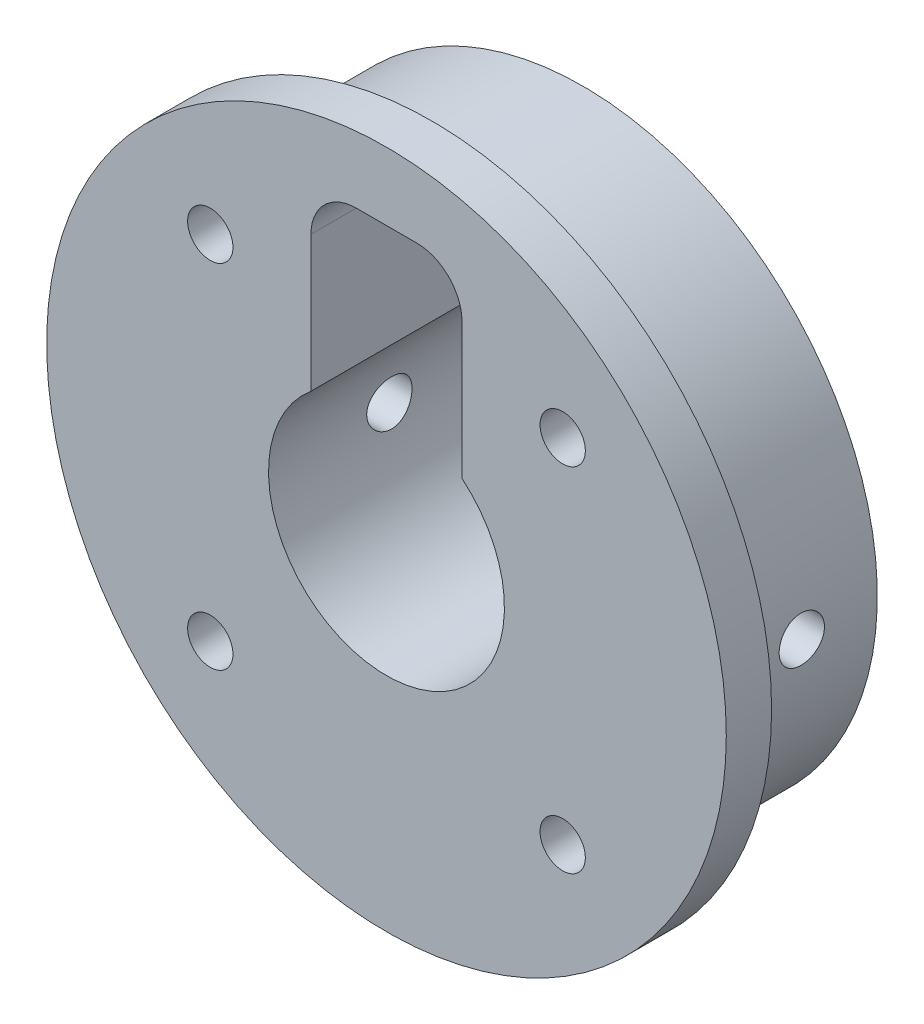
ISO-10303-21;
HEADER;
FILE_DESCRIPTION(('STEP AP214'),'2;1');
FILE_NAME('part.step','',(''),(''),'','','');
FILE_SCHEMA(('AUTOMOTIVE_DESIGN { 1 0 10303 214 1 1 1 1 }'));
ENDSEC;
DATA;
#1=APPLICATION_CONTEXT('core data for automotive mechanical design processes');
#2=APPLICATION_PROTOCOL_DEFINITION('international standard','automotive_design',2000,#1);
#3=PRODUCT_CONTEXT('',#1,'mechanical');
#4=PRODUCT('Part','Part','',(#3));
#5=PRODUCT_RELATED_PRODUCT_CATEGORY('part','',(#4));
#6=PRODUCT_DEFINITION_FORMATION('','',#4);
#7=PRODUCT_DEFINITION_CONTEXT('part definition',#1,'design');
#8=PRODUCT_DEFINITION('design','',#6,#7);
#9=PRODUCT_DEFINITION_SHAPE('','',#8);
#10=(LENGTH_UNIT() NAMED_UNIT(*) SI_UNIT(.MILLI.,.METRE.));
#11=(NAMED_UNIT(*) PLANE_ANGLE_UNIT() SI_UNIT($,.RADIAN.));
#12=(NAMED_UNIT(*) SI_UNIT($,.STERADIAN.) SOLID_ANGLE_UNIT());
#13=UNCERTAINTY_MEASURE_WITH_UNIT(LENGTH_MEASURE(1.E-05),#10,'distance_accuracy_value','');
#14=(GEOMETRIC_REPRESENTATION_CONTEXT(3) GLOBAL_UNCERTAINTY_ASSIGNED_CONTEXT((#13)) GLOBAL_UNIT_ASSIGNED_CONTEXT((#10,
#11,#12)) REPRESENTATION_CONTEXT('',''));
#15=CARTESIAN_POINT('',(0.,0.,0.));
#16=DIRECTION('',(0.,0.,1.));
#17=DIRECTION('',(1.,0.,0.));
#18=AXIS2_PLACEMENT_3D('',#15,#16,#17);
#19=CARTESIAN_POINT('',(750.,29.3136232268283,3.));
#20=DIRECTION('',(0.,0.,-1.));
#21=DIRECTION('',(-1.,0.,0.));
#22=AXIS2_PLACEMENT_3D('',#19,#20,#21);
#23=CYLINDRICAL_SURFACE('',#22,22.5);
#24=CARTESIAN_POINT('',(750.,29.3136232268283,3.));
#25=DIRECTION('',(0.,0.,1.));
#26=DIRECTION('',(1.,0.,0.));
#27=AXIS2_PLACEMENT_3D('',#24,#25,#26);
#28=CIRCLE('',#27,22.5);
#29=CARTESIAN_POINT('',(772.5,29.3136232268283,3.));
#30=VERTEX_POINT('',#29);
#31=EDGE_CURVE('E46',#30,#30,#28,.T.);
#32=ORIENTED_EDGE('',*,*,#31,.F.);
#33=EDGE_LOOP('',(#32));
#34=FACE_BOUND('',#33,.T.);
#35=CARTESIAN_POINT('',(750.,29.3136232268283,0.));
#36=DIRECTION('',(0.,0.,1.));
#37=DIRECTION('',(1.,0.,0.));
#38=AXIS2_PLACEMENT_3D('',#35,#36,#37);
#39=CIRCLE('',#38,22.5);
#40=CARTESIAN_POINT('',(772.5,29.3136232268283,0.));
#41=VERTEX_POINT('',#40);
#42=EDGE_CURVE('E154',#41,#41,#39,.T.);
#43=ORIENTED_EDGE('',*,*,#42,.T.);
#44=EDGE_LOOP('',(#43));
#45=FACE_BOUND('',#44,.T.);
#46=ADVANCED_FACE('F33',(#34,#45),#23,.T.);
#47=CARTESIAN_POINT('',(750.,29.3136232268283,3.));
#48=DIRECTION('',(0.,0.,1.));
#49=DIRECTION('',(1.,0.,0.));
#50=AXIS2_PLACEMENT_3D('',#47,#48,#49);
#51=PLANE('',#50);
#52=DIRECTION('',(0.,1.,0.));
#53=VECTOR('',#52,1.);
#54=CARTESIAN_POINT('',(755.,44.3136232268282,3.));
#55=LINE('',#54,#53);
#56=CARTESIAN_POINT('',(755.,35.3136232268283,3.));
#57=VERTEX_POINT('',#56);
#58=CARTESIAN_POINT('',(755.,44.3136232268282,3.));
#59=VERTEX_POINT('',#58);
#60=EDGE_CURVE('E109',#57,#59,#55,.T.);
#61=ORIENTED_EDGE('',*,*,#60,.F.);
#62=CARTESIAN_POINT('',(750.,29.3136232268283,3.));
#63=DIRECTION('',(0.,0.,1.));
#64=DIRECTION('',(1.,0.,0.));
#65=AXIS2_PLACEMENT_3D('',#62,#63,#64);
#66=CIRCLE('',#65,7.81024967590666);
#67=CARTESIAN_POINT('',(745.,35.3136232268283,3.));
#68=VERTEX_POINT('',#67);
#69=EDGE_CURVE('E121',#68,#57,#66,.T.);
#70=ORIENTED_EDGE('',*,*,#69,.F.);
#71=DIRECTION('',(0.,-1.,0.));
#72=VECTOR('',#71,1.);
#73=CARTESIAN_POINT('',(745.,44.3136232268282,3.));
#74=LINE('',#73,#72);
#75=CARTESIAN_POINT('',(745.,44.3136232268282,3.));
#76=VERTEX_POINT('',#75);
#77=EDGE_CURVE('E54',#76,#68,#74,.T.);
#78=ORIENTED_EDGE('',*,*,#77,.F.);
#79=CARTESIAN_POINT('',(748.,44.3136232268283,3.));
#80=DIRECTION('',(0.,0.,1.));
#81=DIRECTION('',(1.,0.,0.));
#82=AXIS2_PLACEMENT_3D('',#79,#80,#81);
#83=CIRCLE('',#82,3.);
#84=CARTESIAN_POINT('',(748.,47.3136232268283,3.));
#85=VERTEX_POINT('',#84);
#86=EDGE_CURVE('E117',#85,#76,#83,.T.);
#87=ORIENTED_EDGE('',*,*,#86,.F.);
#88=DIRECTION('',(-1.,0.,0.));
#89=VECTOR('',#88,1.);
#90=CARTESIAN_POINT('',(748.,47.3136232268283,3.));
#91=LINE('',#90,#89);
#92=CARTESIAN_POINT('',(752.,47.3136232268283,3.));
#93=VERTEX_POINT('',#92);
#94=EDGE_CURVE('E357',#93,#85,#91,.T.);
#95=ORIENTED_EDGE('',*,*,#94,.F.);
#96=CARTESIAN_POINT('',(752.,44.3136232268283,3.));
#97=DIRECTION('',(0.,0.,1.));
#98=DIRECTION('',(-1.,0.,0.));
#99=AXIS2_PLACEMENT_3D('',#96,#97,#98);
#100=CIRCLE('',#99,3.);
#101=EDGE_CURVE('E356',#59,#93,#100,.T.);
#102=ORIENTED_EDGE('',*,*,#101,.F.);
#103=EDGE_LOOP('',(#61,#70,#78,#87,#95,#102));
#104=FACE_BOUND('',#103,.T.);
#105=CARTESIAN_POINT('',(738.332738110422,17.6463613372503,3.));
#106=DIRECTION('',(0.,0.,1.));
#107=DIRECTION('',(1.,0.,0.));
#108=AXIS2_PLACEMENT_3D('',#105,#106,#107);
#109=CIRCLE('',#108,1.49999999999997);
#110=CARTESIAN_POINT('',(739.832738110422,17.6463613372503,3.));
#111=VERTEX_POINT('',#110);
#112=EDGE_CURVE('E140',#111,#111,#109,.T.);
#113=ORIENTED_EDGE('',*,*,#112,.F.);
#114=EDGE_LOOP('',(#113));
#115=FACE_BOUND('',#114,.T.);
#116=CARTESIAN_POINT('',(738.332738110422,40.9808851164064,3.));
#117=DIRECTION('',(0.,0.,1.));
#118=DIRECTION('',(1.,0.,0.));
#119=AXIS2_PLACEMENT_3D('',#116,#117,#118);
#120=CIRCLE('',#119,1.49999999999997);
#121=CARTESIAN_POINT('',(739.832738110422,40.9808851164064,3.));
#122=VERTEX_POINT('',#121);
#123=EDGE_CURVE('E367',#122,#122,#120,.T.);
#124=ORIENTED_EDGE('',*,*,#123,.F.);
#125=EDGE_LOOP('',(#124));
#126=FACE_BOUND('',#125,.T.);
#127=CARTESIAN_POINT('',(761.667261889578,40.9808851164062,3.));
#128=DIRECTION('',(0.,0.,1.));
#129=DIRECTION('',(1.,0.,0.));
#130=AXIS2_PLACEMENT_3D('',#127,#128,#129);
#131=CIRCLE('',#130,1.49999999999997);
#132=CARTESIAN_POINT('',(763.167261889578,40.9808851164062,3.));
#133=VERTEX_POINT('',#132);
#134=EDGE_CURVE('E368',#133,#133,#131,.T.);
#135=ORIENTED_EDGE('',*,*,#134,.F.);
#136=EDGE_LOOP('',(#135));
#137=FACE_BOUND('',#136,.T.);
#138=CARTESIAN_POINT('',(761.667261889578,17.6463613372502,3.));
#139=DIRECTION('',(0.,0.,1.));
#140=DIRECTION('',(1.,0.,0.));
#141=AXIS2_PLACEMENT_3D('',#138,#139,#140);
#142=CIRCLE('',#141,1.49999999999997);
#143=CARTESIAN_POINT('',(763.167261889578,17.6463613372502,3.));
#144=VERTEX_POINT('',#143);
#145=EDGE_CURVE('E139',#144,#144,#142,.T.);
#146=ORIENTED_EDGE('',*,*,#145,.F.);
#147=EDGE_LOOP('',(#146));
#148=FACE_BOUND('',#147,.T.);
#149=ORIENTED_EDGE('',*,*,#31,.T.);
#150=EDGE_LOOP('',(#149));
#151=FACE_BOUND('',#150,.T.);
#152=ADVANCED_FACE('F199',(#104,#115,#126,#137,#148,#151),#51,.T.);
#153=CARTESIAN_POINT('',(750.,29.3136232268283,0.));
#154=DIRECTION('',(0.,0.,1.));
#155=DIRECTION('',(1.,0.,0.));
#156=AXIS2_PLACEMENT_3D('',#153,#154,#155);
#157=PLANE('',#156);
#158=CARTESIAN_POINT('',(750.,29.3136232268283,0.));
#159=DIRECTION('',(0.,0.,-1.));
#160=DIRECTION('',(-1.,0.,0.));
#161=AXIS2_PLACEMENT_3D('',#158,#159,#160);
#162=CIRCLE('',#161,19.4999999999999);
#163=CARTESIAN_POINT('',(730.5,29.3136232268283,0.));
#164=VERTEX_POINT('',#163);
#165=EDGE_CURVE('E11',#164,#164,#162,.T.);
#166=ORIENTED_EDGE('',*,*,#165,.F.);
#167=EDGE_LOOP('',(#166));
#168=FACE_BOUND('',#167,.T.);
#169=ORIENTED_EDGE('',*,*,#42,.F.);
#170=EDGE_LOOP('',(#169));
#171=FACE_BOUND('',#170,.T.);
#172=ADVANCED_FACE('F196',(#168,#171),#157,.F.);
#173=CARTESIAN_POINT('',(750.,29.3136232268283,-10.));
#174=DIRECTION('',(0.,0.,1.));
#175=DIRECTION('',(1.,0.,0.));
#176=AXIS2_PLACEMENT_3D('',#173,#174,#175);
#177=CYLINDRICAL_SURFACE('',#176,19.4999999999999);
#178=CARTESIAN_POINT('',(769.5,29.3136232268283,-6.50000000000001));
#179=CARTESIAN_POINT('',(769.499999240329,29.2295009906735,-6.49999631612383));
#180=CARTESIAN_POINT('',(769.499449840663,29.1453209343391,-6.49289965396325));
#181=CARTESIAN_POINT('',(769.4973109979,28.9792883284067,-6.46469326607501));
#182=CARTESIAN_POINT('',(769.495720365639,28.8974385518272,-6.44356751768256));
#183=CARTESIAN_POINT('',(769.491678872511,28.738495314461,-6.38791607922069));
#184=CARTESIAN_POINT('',(769.489228487342,28.6613992511427,-6.35339779806699));
#185=CARTESIAN_POINT('',(769.483742556748,28.5141144470609,-6.27195398912453));
#186=CARTESIAN_POINT('',(769.480707139512,28.4439241982119,-6.2250311785145));
#187=CARTESIAN_POINT('',(769.474384506987,28.3122704498914,-6.11999870744527));
#188=CARTESIAN_POINT('',(769.471096813979,28.2508241690554,-6.06186749104647));
#189=CARTESIAN_POINT('',(769.464644203124,28.1385502020399,-5.93611362551084));
#190=CARTESIAN_POINT('',(769.461479290585,28.0877229744524,-5.86849056667229));
#191=CARTESIAN_POINT('',(769.45562529375,27.9980729496452,-5.7255700394826));
#192=CARTESIAN_POINT('',(769.452936802632,27.9592650730584,-5.65026318545963));
#193=CARTESIAN_POINT('',(769.448345262151,27.8948507084839,-5.49417828328676));
#194=CARTESIAN_POINT('',(769.446442200757,27.8692440182933,-5.41340031895939));
#195=CARTESIAN_POINT('',(769.443640832669,27.832008306894,-5.24883709209566));
#196=CARTESIAN_POINT('',(769.44274052867,27.8203514966662,-5.16505815193368));
#197=CARTESIAN_POINT('',(769.442040232918,27.8112606108248,-4.99672832487932));
#198=CARTESIAN_POINT('',(769.442240223289,27.8138263041254,-4.91217745055154));
#199=CARTESIAN_POINT('',(769.443716110968,27.8330846012521,-4.74489391091556));
#200=CARTESIAN_POINT('',(769.444989711576,27.8497470491416,-4.66215775085566));
#201=CARTESIAN_POINT('',(769.448465702716,27.8966790444788,-4.50066003886764));
#202=CARTESIAN_POINT('',(769.450668101139,27.9269487075386,-4.42189852071592));
#203=CARTESIAN_POINT('',(769.45575616458,28.0002698123731,-4.27048947061114));
#204=CARTESIAN_POINT('',(769.458642554889,28.0433348344692,-4.19784854040406));
#205=CARTESIAN_POINT('',(769.464772674995,28.1410143949215,-4.06081486040461));
#206=CARTESIAN_POINT('',(769.468016410941,28.1956291320535,-3.99642225260013));
#207=CARTESIAN_POINT('',(769.474505928725,28.3150271854894,-3.87753770949489));
#208=CARTESIAN_POINT('',(769.477751693938,28.3798365812263,-3.82307196192597));
#209=CARTESIAN_POINT('',(769.483871475001,28.5176931196159,-3.72578953626857));
#210=CARTESIAN_POINT('',(769.486745490647,28.590740266764,-3.68297286453731));
#211=CARTESIAN_POINT('',(769.491798371356,28.7430154073111,-3.61020582566758));
#212=CARTESIAN_POINT('',(769.493977176817,28.8222439299303,-3.58025656160756));
#213=CARTESIAN_POINT('',(769.497393421365,28.9846252469381,-3.53409253716758));
#214=CARTESIAN_POINT('',(769.498630877098,29.0677779719082,-3.51787753392713));
#215=CARTESIAN_POINT('',(769.500022853301,29.2354202289245,-3.49967501879704));
#216=CARTESIAN_POINT('',(769.500180127908,29.3199058102681,-3.4976513230533));
#217=CARTESIAN_POINT('',(769.499401366525,29.4880150994303,-3.50779416234267));
#218=CARTESIAN_POINT('',(769.498465339204,29.5716388140779,-3.51996058485493));
#219=CARTESIAN_POINT('',(769.49560704767,29.735547848141,-3.55810832036623));
#220=CARTESIAN_POINT('',(769.493685976772,29.8158370801327,-3.58407291917263));
#221=CARTESIAN_POINT('',(769.489073510374,29.97091908414,-3.64906292966387));
#222=CARTESIAN_POINT('',(769.486382104448,30.0457117817555,-3.68808851810011));
#223=CARTESIAN_POINT('',(769.48052404355,30.1878426448235,-3.77818404496661));
#224=CARTESIAN_POINT('',(769.477356444753,30.2551655337424,-3.82927802070011));
#225=CARTESIAN_POINT('',(769.470905257215,30.3802916657135,-3.94202514023412));
#226=CARTESIAN_POINT('',(769.467621666756,30.4380947677437,-4.00367844042824));
#227=CARTESIAN_POINT('',(769.461300477786,30.5426641059793,-4.13595081174335));
#228=CARTESIAN_POINT('',(769.458263413415,30.5894067763267,-4.20658854214855));
#229=CARTESIAN_POINT('',(769.452786433225,30.670366949817,-4.35473145186864));
#230=CARTESIAN_POINT('',(769.450346512205,30.7045845620479,-4.43223657136415));
#231=CARTESIAN_POINT('',(769.446342888643,30.7594829369239,-4.59182984208193));
#232=CARTESIAN_POINT('',(769.444778243733,30.7801782624209,-4.67391295923841));
#233=CARTESIAN_POINT('',(769.442699053004,30.8074920642696,-4.84040145112596));
#234=CARTESIAN_POINT('',(769.442184490331,30.8141107665626,-4.92480678856146));
#235=CARTESIAN_POINT('',(769.442263919749,30.8130809941976,-5.09330954611887));
#236=CARTESIAN_POINT('',(769.442855034413,30.8054695522476,-5.17740719640398));
#237=CARTESIAN_POINT('',(769.445073105625,30.7762726257923,-5.34312619791526));
#238=CARTESIAN_POINT('',(769.446700063867,30.7546871184431,-5.42474754509312));
#239=CARTESIAN_POINT('',(769.450805756996,30.6981638575086,-5.58320041168871));
#240=CARTESIAN_POINT('',(769.453284459351,30.6632266138792,-5.66003211391176));
#241=CARTESIAN_POINT('',(769.458814377236,30.5809959847591,-5.80674525726494));
#242=CARTESIAN_POINT('',(769.461865581814,30.5337028356212,-5.87662683130703));
#243=CARTESIAN_POINT('',(769.468206099535,30.427964073564,-6.00764522480086));
#244=CARTESIAN_POINT('',(769.471495982727,30.3694911764461,-6.06875999660285));
#245=CARTESIAN_POINT('',(769.477938012782,30.2430994351566,-6.18033061393549));
#246=CARTESIAN_POINT('',(769.481090126003,30.1751783004836,-6.23078386733981));
#247=CARTESIAN_POINT('',(769.486906301575,30.0317055870545,-6.31965640961626));
#248=CARTESIAN_POINT('',(769.489569551509,29.9561416244903,-6.35805574051926));
#249=CARTESIAN_POINT('',(769.494098032498,29.7996710699569,-6.42157341954096));
#250=CARTESIAN_POINT('',(769.495964186248,29.7187707811351,-6.44670713153661));
#251=CARTESIAN_POINT('',(769.498205757804,29.5834264721995,-6.4765344902111));
#252=CARTESIAN_POINT('',(769.498875560298,29.5298544495082,-6.4853224684822));
#253=CARTESIAN_POINT('',(769.499772925798,29.4220707039385,-6.49705640448193));
#254=CARTESIAN_POINT('',(769.500000489779,29.3678589824706,-6.50000237508913));
#255=CARTESIAN_POINT('',(769.5,29.3136232268283,-6.50000000000001));
#256=B_SPLINE_CURVE_WITH_KNOTS('',3,(#178,#179,#180,#181,#182,#183,#184,#185,#186,#187,#188,
#189,#190,#191,#192,#193,#194,#195,#196,#197,#198,#199,#200,#201,#202,#203,#204,#205,#206,#207,
#208,#209,#210,#211,#212,#213,#214,#215,#216,#217,#218,#219,#220,#221,#222,#223,#224,#225,#226,
#227,#228,#229,#230,#231,#232,#233,#234,#235,#236,#237,#238,#239,#240,#241,#242,#243,#244,#245,
#246,#247,#248,#249,#250,#251,#252,#253,#254,#255),.UNSPECIFIED.,.T.,.F.,(4,2,2,2,2,2,2,2,2,2,2,
2,2,2,2,2,2,2,2,2,2,2,2,2,2,2,2,2,2,2,2,2,2,2,2,2,2,2,4),(0.,0.252168697972929,
0.504625895091495,0.756943628431351,1.00920613798227,1.26195872563513,1.51472222634619,
1.76779825752813,2.02087041222531,2.27343758794004,2.52600065998191,2.77802480841939,
3.03005109819102,3.28234583677959,3.53464491782508,3.78760023996436,4.04055570014811,
4.29353284100557,4.54650550841981,4.79883293118749,5.05115835313294,5.3031788192332,
5.55520269600725,5.80773284029632,6.0602667251199,6.31333392041088,6.56639891154052,
6.81919091267429,7.07197885625816,7.32410985684674,7.57624126960227,7.82836305341542,
8.08048001480753,8.33322030876309,8.58602198074126,8.83924004130861,9.0921641845181,
9.25474414742467,9.41732375192724),.UNSPECIFIED.);
#257=CARTESIAN_POINT('',(769.5,29.3136232268283,-6.50000000000001));
#258=VERTEX_POINT('',#257);
#259=EDGE_CURVE('E186',#258,#258,#256,.T.);
#260=ORIENTED_EDGE('',*,*,#259,.T.);
#261=EDGE_LOOP('',(#260));
#262=FACE_BOUND('',#261,.T.);
#263=CARTESIAN_POINT('',(730.5,29.3136232268283,-6.50000000000001));
#264=CARTESIAN_POINT('',(730.500000759671,29.3977454629831,-6.49999631612383));
#265=CARTESIAN_POINT('',(730.500550159337,29.4819255193175,-6.49289965396326));
#266=CARTESIAN_POINT('',(730.5026890021,29.6479581252499,-6.46469326607502));
#267=CARTESIAN_POINT('',(730.504279634361,29.7298079018294,-6.44356751768257));
#268=CARTESIAN_POINT('',(730.508321127489,29.8887511391956,-6.3879160792207));
#269=CARTESIAN_POINT('',(730.510771512658,29.9658472025139,-6.35339779806701));
#270=CARTESIAN_POINT('',(730.516257443252,30.1131320065957,-6.27195398912455));
#271=CARTESIAN_POINT('',(730.519292860488,30.1833222554447,-6.22503117851453));
#272=CARTESIAN_POINT('',(730.525615493013,30.3149760037652,-6.1199987074453));
#273=CARTESIAN_POINT('',(730.528903186021,30.3764222846012,-6.06186749104651));
#274=CARTESIAN_POINT('',(730.535355796876,30.4886962516167,-5.93611362551088));
#275=CARTESIAN_POINT('',(730.538520709415,30.5395234792042,-5.86849056667233));
#276=CARTESIAN_POINT('',(730.54437470625,30.6291735040114,-5.72557003948264));
#277=CARTESIAN_POINT('',(730.547063197368,30.6679813805982,-5.65026318545967));
#278=CARTESIAN_POINT('',(730.55165473785,30.7323957451727,-5.49417828328681));
#279=CARTESIAN_POINT('',(730.553557799244,30.7580024353633,-5.41340031895943));
#280=CARTESIAN_POINT('',(730.556359167331,30.7952381467626,-5.2488370920957));
#281=CARTESIAN_POINT('',(730.557259471331,30.8068949569904,-5.16505815193372));
#282=CARTESIAN_POINT('',(730.557959767082,30.8159858428319,-4.99672832487937));
#283=CARTESIAN_POINT('',(730.557759776711,30.8134201495313,-4.91217745055159));
#284=CARTESIAN_POINT('',(730.556283889033,30.7941618524045,-4.7448939109156));
#285=CARTESIAN_POINT('',(730.555010288424,30.777499404515,-4.6621577508557));
#286=CARTESIAN_POINT('',(730.551534297285,30.7305674091778,-4.50066003886768));
#287=CARTESIAN_POINT('',(730.549331898862,30.700297746118,-4.42189852071597));
#288=CARTESIAN_POINT('',(730.54424383542,30.6269766412835,-4.27048947061119));
#289=CARTESIAN_POINT('',(730.541357445111,30.5839116191874,-4.1978485404041));
#290=CARTESIAN_POINT('',(730.535227325006,30.4862320587351,-4.06081486040464));
#291=CARTESIAN_POINT('',(730.531983589059,30.4316173216032,-3.99642225260016));
#292=CARTESIAN_POINT('',(730.525494071276,30.3122192681673,-3.87753770949491));
#293=CARTESIAN_POINT('',(730.522248306062,30.2474098724303,-3.823071961926));
#294=CARTESIAN_POINT('',(730.516128525,30.1095533340408,-3.72578953626859));
#295=CARTESIAN_POINT('',(730.513254509354,30.0365061868926,-3.68297286453733));
#296=CARTESIAN_POINT('',(730.508201628645,29.8842310463456,-3.6102058256676));
#297=CARTESIAN_POINT('',(730.506022823183,29.8050025237263,-3.58025656160758));
#298=CARTESIAN_POINT('',(730.502606578635,29.6426212067186,-3.53409253716759));
#299=CARTESIAN_POINT('',(730.501369122902,29.5594684817484,-3.51787753392713));
#300=CARTESIAN_POINT('',(730.499977146699,29.3918262247322,-3.49967501879704));
#301=CARTESIAN_POINT('',(730.499819872092,29.3073406433886,-3.4976513230533));
#302=CARTESIAN_POINT('',(730.500598633475,29.1392313542264,-3.50779416234266));
#303=CARTESIAN_POINT('',(730.501534660796,29.0556076395788,-3.51996058485492));
#304=CARTESIAN_POINT('',(730.50439295233,28.8916986055157,-3.55810832036622));
#305=CARTESIAN_POINT('',(730.506314023228,28.811409373524,-3.58407291917262));
#306=CARTESIAN_POINT('',(730.510926489626,28.6563273695167,-3.64906292966385));
#307=CARTESIAN_POINT('',(730.513617895552,28.5815346719012,-3.68808851810009));
#308=CARTESIAN_POINT('',(730.519475956451,28.4394038088332,-3.77818404496659));
#309=CARTESIAN_POINT('',(730.522643555247,28.3720809199142,-3.82927802070008));
#310=CARTESIAN_POINT('',(730.529094742785,28.2469547879431,-3.94202514023409));
#311=CARTESIAN_POINT('',(730.532378333244,28.1891516859129,-4.00367844042821));
#312=CARTESIAN_POINT('',(730.538699522214,28.0845823476773,-4.13595081174331));
#313=CARTESIAN_POINT('',(730.541736586585,28.0378396773299,-4.20658854214852));
#314=CARTESIAN_POINT('',(730.547213566775,27.9568795038396,-4.3547314518686));
#315=CARTESIAN_POINT('',(730.549653487795,27.9226618916087,-4.43223657136411));
#316=CARTESIAN_POINT('',(730.553657111357,27.8677635167327,-4.59182984208189));
#317=CARTESIAN_POINT('',(730.555221756268,27.8470681912357,-4.67391295923837));
#318=CARTESIAN_POINT('',(730.557300946996,27.8197543893871,-4.84040145112592));
#319=CARTESIAN_POINT('',(730.557815509669,27.813135687094,-4.92480678856142));
#320=CARTESIAN_POINT('',(730.557736080251,27.814165459459,-5.09330954611883));
#321=CARTESIAN_POINT('',(730.557144965587,27.821776901409,-5.17740719640393));
#322=CARTESIAN_POINT('',(730.554926894375,27.8509738278643,-5.34312619791522));
#323=CARTESIAN_POINT('',(730.553299936133,27.8725593352135,-5.42474754509308));
#324=CARTESIAN_POINT('',(730.549194243005,27.929082596148,-5.58320041168867));
#325=CARTESIAN_POINT('',(730.546715540649,27.9640198397774,-5.66003211391172));
#326=CARTESIAN_POINT('',(730.541185622764,28.0462504688975,-5.8067452572649));
#327=CARTESIAN_POINT('',(730.538134418187,28.0935436180354,-5.87662683130699));
#328=CARTESIAN_POINT('',(730.531793900465,28.1992823800926,-6.00764522480083));
#329=CARTESIAN_POINT('',(730.528504017274,28.2577552772105,-6.06875999660282));
#330=CARTESIAN_POINT('',(730.522061987218,28.3841470185,-6.18033061393547));
#331=CARTESIAN_POINT('',(730.518909873998,28.452068153173,-6.23078386733978));
#332=CARTESIAN_POINT('',(730.513093698425,28.5955408666021,-6.31965640961624));
#333=CARTESIAN_POINT('',(730.510430448491,28.6711048291663,-6.35805574051924));
#334=CARTESIAN_POINT('',(730.505901967502,28.8275753836997,-6.42157341954095));
#335=CARTESIAN_POINT('',(730.504035813752,28.9084756725215,-6.4467071315366));
#336=CARTESIAN_POINT('',(730.501794242196,29.043819981457,-6.4765344902111));
#337=CARTESIAN_POINT('',(730.501124439702,29.0973920041484,-6.48532246848219));
#338=CARTESIAN_POINT('',(730.500227074203,29.205175749718,-6.49705640448193));
#339=CARTESIAN_POINT('',(730.499999510221,29.2593874711859,-6.50000237508913));
#340=CARTESIAN_POINT('',(730.5,29.3136232268283,-6.50000000000001));
#341=B_SPLINE_CURVE_WITH_KNOTS('',3,(#263,#264,#265,#266,#267,#268,#269,#270,#271,#272,#273,
#274,#275,#276,#277,#278,#279,#280,#281,#282,#283,#284,#285,#286,#287,#288,#289,#290,#291,#292,
#293,#294,#295,#296,#297,#298,#299,#300,#301,#302,#303,#304,#305,#306,#307,#308,#309,#310,#311,
#312,#313,#314,#315,#316,#317,#318,#319,#320,#321,#322,#323,#324,#325,#326,#327,#328,#329,#330,
#331,#332,#333,#334,#335,#336,#337,#338,#339,#340),.UNSPECIFIED.,.T.,.F.,(4,2,2,2,2,2,2,2,2,2,2,
2,2,2,2,2,2,2,2,2,2,2,2,2,2,2,2,2,2,2,2,2,2,2,2,2,2,2,4),(0.,0.252168697972932,
0.504625895091496,0.756943628431356,1.00920613798227,1.26195872563512,1.51472222634618,
1.76779825752813,2.02087041222532,2.27343758794005,2.52600065998191,2.77802480841939,
3.03005109819102,3.28234583677959,3.53464491782508,3.78760023996436,4.04055570014811,
4.29353284100557,4.54650550841982,4.7988329311875,5.05115835313294,5.30317881923321,
5.55520269600725,5.80773284029632,6.0602667251199,6.31333392041088,6.56639891154052,
6.81919091267429,7.07197885625816,7.32410985684674,7.57624126960227,7.82836305341542,
8.08048001480753,8.33322030876309,8.58602198074126,8.83924004130862,9.0921641845181,
9.25474414742467,9.41732375192724),.UNSPECIFIED.);
#342=CARTESIAN_POINT('',(730.5,29.3136232268283,-6.50000000000001));
#343=VERTEX_POINT('',#342);
#344=EDGE_CURVE('E180',#343,#343,#341,.T.);
#345=ORIENTED_EDGE('',*,*,#344,.T.);
#346=EDGE_LOOP('',(#345));
#347=FACE_BOUND('',#346,.T.);
#348=CARTESIAN_POINT('',(750.,29.3136232268283,-10.));
#349=DIRECTION('',(0.,0.,-1.));
#350=DIRECTION('',(-1.,0.,0.));
#351=AXIS2_PLACEMENT_3D('',#348,#349,#350);
#352=CIRCLE('',#351,19.4999999999999);
#353=CARTESIAN_POINT('',(730.5,29.3136232268283,-10.));
#354=VERTEX_POINT('',#353);
#355=EDGE_CURVE('E152',#354,#354,#352,.T.);
#356=ORIENTED_EDGE('',*,*,#355,.F.);
#357=EDGE_LOOP('',(#356));
#358=FACE_BOUND('',#357,.T.);
#359=ORIENTED_EDGE('',*,*,#165,.T.);
#360=EDGE_LOOP('',(#359));
#361=FACE_BOUND('',#360,.T.);
#362=ADVANCED_FACE('F191',(#262,#347,#358,#361),#177,.T.);
#363=CARTESIAN_POINT('',(750.,29.3136232268283,-10.));
#364=DIRECTION('',(0.,0.,-1.));
#365=DIRECTION('',(-1.,0.,0.));
#366=AXIS2_PLACEMENT_3D('',#363,#364,#365);
#367=PLANE('',#366);
#368=DIRECTION('',(0.,1.,0.));
#369=VECTOR('',#368,1.);
#370=CARTESIAN_POINT('',(755.,44.3136232268282,-10.));
#371=LINE('',#370,#369);
#372=CARTESIAN_POINT('',(755.,35.3136232268283,-10.));
#373=VERTEX_POINT('',#372);
#374=CARTESIAN_POINT('',(755.,44.3136232268282,-10.));
#375=VERTEX_POINT('',#374);
#376=EDGE_CURVE('E106',#373,#375,#371,.T.);
#377=ORIENTED_EDGE('',*,*,#376,.T.);
#378=CARTESIAN_POINT('',(752.,44.3136232268283,-10.));
#379=DIRECTION('',(0.,0.,-1.));
#380=DIRECTION('',(-1.,0.,0.));
#381=AXIS2_PLACEMENT_3D('',#378,#379,#380);
#382=CIRCLE('',#381,3.);
#383=CARTESIAN_POINT('',(752.,47.3136232268283,-10.));
#384=VERTEX_POINT('',#383);
#385=EDGE_CURVE('E93',#375,#384,#382,.F.);
#386=ORIENTED_EDGE('',*,*,#385,.T.);
#387=DIRECTION('',(-1.,0.,0.));
#388=VECTOR('',#387,1.);
#389=CARTESIAN_POINT('',(748.,47.3136232268283,-10.));
#390=LINE('',#389,#388);
#391=CARTESIAN_POINT('',(748.,47.3136232268283,-10.));
#392=VERTEX_POINT('',#391);
#393=EDGE_CURVE('E132',#384,#392,#390,.T.);
#394=ORIENTED_EDGE('',*,*,#393,.T.);
#395=CARTESIAN_POINT('',(748.,44.3136232268283,-10.));
#396=DIRECTION('',(0.,0.,-1.));
#397=DIRECTION('',(-1.,0.,0.));
#398=AXIS2_PLACEMENT_3D('',#395,#396,#397);
#399=CIRCLE('',#398,3.);
#400=CARTESIAN_POINT('',(745.,44.3136232268283,-10.));
#401=VERTEX_POINT('',#400);
#402=EDGE_CURVE('E128',#392,#401,#399,.F.);
#403=ORIENTED_EDGE('',*,*,#402,.T.);
#404=DIRECTION('',(0.,-1.,0.));
#405=VECTOR('',#404,1.);
#406=CARTESIAN_POINT('',(745.,44.3136232268282,-10.));
#407=LINE('',#406,#405);
#408=CARTESIAN_POINT('',(745.,35.3136232268283,-10.));
#409=VERTEX_POINT('',#408);
#410=EDGE_CURVE('E125',#401,#409,#407,.T.);
#411=ORIENTED_EDGE('',*,*,#410,.T.);
#412=CARTESIAN_POINT('',(750.,29.3136232268283,-10.));
#413=DIRECTION('',(0.,0.,-1.));
#414=DIRECTION('',(-1.,0.,0.));
#415=AXIS2_PLACEMENT_3D('',#412,#413,#414);
#416=CIRCLE('',#415,7.81024967590666);
#417=EDGE_CURVE('E115',#409,#373,#416,.F.);
#418=ORIENTED_EDGE('',*,*,#417,.T.);
#419=EDGE_LOOP('',(#377,#386,#394,#403,#411,#418));
#420=FACE_BOUND('',#419,.T.);
#421=CARTESIAN_POINT('',(738.332738110422,17.6463613372503,-10.));
#422=DIRECTION('',(0.,0.,-1.));
#423=DIRECTION('',(-1.,0.,0.));
#424=AXIS2_PLACEMENT_3D('',#421,#422,#423);
#425=CIRCLE('',#424,1.49999999999997);
#426=CARTESIAN_POINT('',(736.832738110422,17.6463613372503,-10.));
#427=VERTEX_POINT('',#426);
#428=EDGE_CURVE('E143',#427,#427,#425,.F.);
#429=ORIENTED_EDGE('',*,*,#428,.T.);
#430=EDGE_LOOP('',(#429));
#431=FACE_BOUND('',#430,.T.);
#432=CARTESIAN_POINT('',(738.332738110422,40.9808851164064,-10.));
#433=DIRECTION('',(0.,0.,-1.));
#434=DIRECTION('',(-1.,0.,0.));
#435=AXIS2_PLACEMENT_3D('',#432,#433,#434);
#436=CIRCLE('',#435,1.49999999999997);
#437=CARTESIAN_POINT('',(736.832738110422,40.9808851164064,-10.));
#438=VERTEX_POINT('',#437);
#439=EDGE_CURVE('E144',#438,#438,#436,.F.);
#440=ORIENTED_EDGE('',*,*,#439,.T.);
#441=EDGE_LOOP('',(#440));
#442=FACE_BOUND('',#441,.T.);
#443=CARTESIAN_POINT('',(761.667261889578,40.9808851164062,-10.));
#444=DIRECTION('',(0.,0.,-1.));
#445=DIRECTION('',(-1.,0.,0.));
#446=AXIS2_PLACEMENT_3D('',#443,#444,#445);
#447=CIRCLE('',#446,1.49999999999997);
#448=CARTESIAN_POINT('',(760.167261889578,40.9808851164062,-10.));
#449=VERTEX_POINT('',#448);
#450=EDGE_CURVE('E364',#449,#449,#447,.F.);
#451=ORIENTED_EDGE('',*,*,#450,.T.);
#452=EDGE_LOOP('',(#451));
#453=FACE_BOUND('',#452,.T.);
#454=CARTESIAN_POINT('',(761.667261889578,17.6463613372502,-10.));
#455=DIRECTION('',(0.,0.,-1.));
#456=DIRECTION('',(-1.,0.,0.));
#457=AXIS2_PLACEMENT_3D('',#454,#455,#456);
#458=CIRCLE('',#457,1.49999999999997);
#459=CARTESIAN_POINT('',(760.167261889578,17.6463613372502,-10.));
#460=VERTEX_POINT('',#459);
#461=EDGE_CURVE('E149',#460,#460,#458,.F.);
#462=ORIENTED_EDGE('',*,*,#461,.T.);
#463=EDGE_LOOP('',(#462));
#464=FACE_BOUND('',#463,.T.);
#465=ORIENTED_EDGE('',*,*,#355,.T.);
#466=EDGE_LOOP('',(#465));
#467=FACE_BOUND('',#466,.T.);
#468=ADVANCED_FACE('F112',(#420,#431,#442,#453,#464,#467),#367,.T.);
#469=CARTESIAN_POINT('',(761.667261889578,17.6463613372502,-40.1690070823129));
#470=DIRECTION('',(0.,0.,1.));
#471=DIRECTION('',(1.,0.,0.));
#472=AXIS2_PLACEMENT_3D('',#469,#470,#471);
#473=CYLINDRICAL_SURFACE('',#472,1.49999999999997);
#474=ORIENTED_EDGE('',*,*,#145,.T.);
#475=EDGE_LOOP('',(#474));
#476=FACE_BOUND('',#475,.T.);
#477=ORIENTED_EDGE('',*,*,#461,.F.);
#478=EDGE_LOOP('',(#477));
#479=FACE_BOUND('',#478,.T.);
#480=ADVANCED_FACE('F232',(#476,#479),#473,.F.);
#481=CARTESIAN_POINT('',(761.667261889578,40.9808851164062,-40.1690070823129));
#482=DIRECTION('',(0.,0.,1.));
#483=DIRECTION('',(1.,0.,0.));
#484=AXIS2_PLACEMENT_3D('',#481,#482,#483);
#485=CYLINDRICAL_SURFACE('',#484,1.49999999999997);
#486=ORIENTED_EDGE('',*,*,#134,.T.);
#487=EDGE_LOOP('',(#486));
#488=FACE_BOUND('',#487,.T.);
#489=ORIENTED_EDGE('',*,*,#450,.F.);
#490=EDGE_LOOP('',(#489));
#491=FACE_BOUND('',#490,.T.);
#492=ADVANCED_FACE('F241',(#488,#491),#485,.F.);
#493=CARTESIAN_POINT('',(738.332738110422,40.9808851164064,-40.1690070823129));
#494=DIRECTION('',(0.,0.,1.));
#495=DIRECTION('',(1.,0.,0.));
#496=AXIS2_PLACEMENT_3D('',#493,#494,#495);
#497=CYLINDRICAL_SURFACE('',#496,1.49999999999997);
#498=ORIENTED_EDGE('',*,*,#123,.T.);
#499=EDGE_LOOP('',(#498));
#500=FACE_BOUND('',#499,.T.);
#501=ORIENTED_EDGE('',*,*,#439,.F.);
#502=EDGE_LOOP('',(#501));
#503=FACE_BOUND('',#502,.T.);
#504=ADVANCED_FACE('F174',(#500,#503),#497,.F.);
#505=CARTESIAN_POINT('',(738.332738110422,17.6463613372503,-40.1690070823129));
#506=DIRECTION('',(0.,0.,1.));
#507=DIRECTION('',(1.,0.,0.));
#508=AXIS2_PLACEMENT_3D('',#505,#506,#507);
#509=CYLINDRICAL_SURFACE('',#508,1.49999999999997);
#510=ORIENTED_EDGE('',*,*,#112,.T.);
#511=EDGE_LOOP('',(#510));
#512=FACE_BOUND('',#511,.T.);
#513=ORIENTED_EDGE('',*,*,#428,.F.);
#514=EDGE_LOOP('',(#513));
#515=FACE_BOUND('',#514,.T.);
#516=ADVANCED_FACE('F258',(#512,#515),#509,.F.);
#517=CARTESIAN_POINT('',(755.,44.3136232268282,-40.1690070823129));
#518=DIRECTION('',(1.,0.,0.));
#519=DIRECTION('',(0.,0.,-1.));
#520=AXIS2_PLACEMENT_3D('',#517,#518,#519);
#521=PLANE('',#520);
#522=DIRECTION('',(0.,0.,1.));
#523=VECTOR('',#522,1.);
#524=CARTESIAN_POINT('',(755.,35.3136232268283,-40.1690070823129));
#525=LINE('',#524,#523);
#526=EDGE_CURVE('E62',#373,#57,#525,.T.);
#527=ORIENTED_EDGE('',*,*,#526,.T.);
#528=ORIENTED_EDGE('',*,*,#60,.T.);
#529=DIRECTION('',(0.,0.,1.));
#530=VECTOR('',#529,1.);
#531=CARTESIAN_POINT('',(755.,44.3136232268282,-40.1690070823129));
#532=LINE('',#531,#530);
#533=EDGE_CURVE('E97',#375,#59,#532,.T.);
#534=ORIENTED_EDGE('',*,*,#533,.F.);
#535=ORIENTED_EDGE('',*,*,#376,.F.);
#536=EDGE_LOOP('',(#527,#528,#534,#535));
#537=FACE_BOUND('',#536,.T.);
#538=ADVANCED_FACE('F105',(#537),#521,.F.);
#539=CARTESIAN_POINT('',(752.,44.3136232268283,-40.1690070823129));
#540=DIRECTION('',(0.,0.,1.));
#541=DIRECTION('',(1.,0.,0.));
#542=AXIS2_PLACEMENT_3D('',#539,#540,#541);
#543=CYLINDRICAL_SURFACE('',#542,3.);
#544=ORIENTED_EDGE('',*,*,#533,.T.);
#545=ORIENTED_EDGE('',*,*,#101,.T.);
#546=DIRECTION('',(0.,0.,1.));
#547=VECTOR('',#546,1.);
#548=CARTESIAN_POINT('',(752.,47.3136232268283,-40.1690070823129));
#549=LINE('',#548,#547);
#550=EDGE_CURVE('E99',#384,#93,#549,.T.);
#551=ORIENTED_EDGE('',*,*,#550,.F.);
#552=ORIENTED_EDGE('',*,*,#385,.F.);
#553=EDGE_LOOP('',(#544,#545,#551,#552));
#554=FACE_BOUND('',#553,.T.);
#555=ADVANCED_FACE('F95',(#554),#543,.F.);
#556=CARTESIAN_POINT('',(748.,47.3136232268283,-40.1690070823129));
#557=DIRECTION('',(0.,1.,0.));
#558=DIRECTION('',(0.,0.,1.));
#559=AXIS2_PLACEMENT_3D('',#556,#557,#558);
#560=PLANE('',#559);
#561=ORIENTED_EDGE('',*,*,#550,.T.);
#562=ORIENTED_EDGE('',*,*,#94,.T.);
#563=DIRECTION('',(0.,0.,1.));
#564=VECTOR('',#563,1.);
#565=CARTESIAN_POINT('',(748.,47.3136232268283,-40.1690070823129));
#566=LINE('',#565,#564);
#567=EDGE_CURVE('E131',#392,#85,#566,.T.);
#568=ORIENTED_EDGE('',*,*,#567,.F.);
#569=ORIENTED_EDGE('',*,*,#393,.F.);
#570=EDGE_LOOP('',(#561,#562,#568,#569));
#571=FACE_BOUND('',#570,.T.);
#572=ADVANCED_FACE('F284',(#571),#560,.F.);
#573=CARTESIAN_POINT('',(748.,44.3136232268283,-40.1690070823129));
#574=DIRECTION('',(0.,0.,1.));
#575=DIRECTION('',(1.,0.,0.));
#576=AXIS2_PLACEMENT_3D('',#573,#574,#575);
#577=CYLINDRICAL_SURFACE('',#576,3.);
#578=ORIENTED_EDGE('',*,*,#567,.T.);
#579=ORIENTED_EDGE('',*,*,#86,.T.);
#580=DIRECTION('',(0.,0.,1.));
#581=VECTOR('',#580,1.);
#582=CARTESIAN_POINT('',(745.,44.3136232268282,-40.1690070823129));
#583=LINE('',#582,#581);
#584=EDGE_CURVE('E127',#401,#76,#583,.T.);
#585=ORIENTED_EDGE('',*,*,#584,.F.);
#586=ORIENTED_EDGE('',*,*,#402,.F.);
#587=EDGE_LOOP('',(#578,#579,#585,#586));
#588=FACE_BOUND('',#587,.T.);
#589=ADVANCED_FACE('F293',(#588),#577,.F.);
#590=CARTESIAN_POINT('',(745.,44.3136232268282,-40.1690070823129));
#591=DIRECTION('',(-1.,0.,0.));
#592=DIRECTION('',(0.,0.,1.));
#593=AXIS2_PLACEMENT_3D('',#590,#591,#592);
#594=PLANE('',#593);
#595=ORIENTED_EDGE('',*,*,#584,.T.);
#596=ORIENTED_EDGE('',*,*,#77,.T.);
#597=DIRECTION('',(0.,0.,1.));
#598=VECTOR('',#597,1.);
#599=CARTESIAN_POINT('',(745.,35.3136232268283,-40.1690070823129));
#600=LINE('',#599,#598);
#601=EDGE_CURVE('E124',#409,#68,#600,.T.);
#602=ORIENTED_EDGE('',*,*,#601,.F.);
#603=ORIENTED_EDGE('',*,*,#410,.F.);
#604=EDGE_LOOP('',(#595,#596,#602,#603));
#605=FACE_BOUND('',#604,.T.);
#606=ADVANCED_FACE('F303',(#605),#594,.F.);
#607=CARTESIAN_POINT('',(750.,29.3136232268283,-40.1690070823129));
#608=DIRECTION('',(0.,0.,1.));
#609=DIRECTION('',(1.,0.,0.));
#610=AXIS2_PLACEMENT_3D('',#607,#608,#609);
#611=CYLINDRICAL_SURFACE('',#610,7.81024967590666);
#612=CARTESIAN_POINT('',(742.189750324093,29.3136232268283,-6.50000000000001));
#613=CARTESIAN_POINT('',(742.189751846888,29.2301894991776,-6.49999685284134));
#614=CARTESIAN_POINT('',(742.191101031509,29.1467152452526,-6.493015290696));
#615=CARTESIAN_POINT('',(742.196353120246,28.9821215739469,-6.4652929845391));
#616=CARTESIAN_POINT('',(742.200258134406,28.9010041601689,-6.44454087163012));
#617=CARTESIAN_POINT('',(742.210185333535,28.7435281261861,-6.38993842338061));
#618=CARTESIAN_POINT('',(742.21620556445,28.6671651901431,-6.35610017422541));
#619=CARTESIAN_POINT('',(742.229706849455,28.5212069246065,-6.27632088567149));
#620=CARTESIAN_POINT('',(742.237187796511,28.4516110998174,-6.23038073294447));
#621=CARTESIAN_POINT('',(742.25289050803,28.3202837184498,-6.1270906177793));
#622=CARTESIAN_POINT('',(742.261119648292,28.2586492523044,-6.06961831927908));
#623=CARTESIAN_POINT('',(742.277336916746,28.1458343678446,-5.94515843909293));
#624=CARTESIAN_POINT('',(742.28532502706,28.0946547233896,-5.8781701536613));
#625=CARTESIAN_POINT('',(742.300227600534,28.0037950841456,-5.73588932266026));
#626=CARTESIAN_POINT('',(742.307132560647,27.9642144867767,-5.66053221940193));
#627=CARTESIAN_POINT('',(742.31898280266,27.8983129599973,-5.50408308759426));
#628=CARTESIAN_POINT('',(742.323928262282,27.8719908280198,-5.42299157992694));
#629=CARTESIAN_POINT('',(742.331225181861,27.83366630813,-5.25841646507743));
#630=CARTESIAN_POINT('',(742.333607355102,27.821494228894,-5.17497376285761));
#631=CARTESIAN_POINT('',(742.335600526558,27.8112884919243,-5.00719910275117));
#632=CARTESIAN_POINT('',(742.335211785677,27.8132535030627,-4.92286722933426));
#633=CARTESIAN_POINT('',(742.331734994051,27.8311287128936,-4.7569418027383));
#634=CARTESIAN_POINT('',(742.328684403224,27.8468453942831,-4.67532650058849));
#635=CARTESIAN_POINT('',(742.320286527118,27.8914727953813,-4.51591303698047));
#636=CARTESIAN_POINT('',(742.314939139907,27.9203841006714,-4.43811504510538));
#637=CARTESIAN_POINT('',(742.302511335349,27.9907677143227,-4.28798143019448));
#638=CARTESIAN_POINT('',(742.295420261517,28.0323176480272,-4.21568311701992));
#639=CARTESIAN_POINT('',(742.280311041638,28.1267442157138,-4.07901197463378));
#640=CARTESIAN_POINT('',(742.272292797081,28.1796220537707,-4.01463998908021));
#641=CARTESIAN_POINT('',(742.256069801332,28.2962441953984,-3.89453120975822));
#642=CARTESIAN_POINT('',(742.247864160007,28.3601538941325,-3.83895500556751));
#643=CARTESIAN_POINT('',(742.232312767162,28.4964735180611,-3.73928773780857));
#644=CARTESIAN_POINT('',(742.224967025088,28.5688835366129,-3.69519680039781));
#645=CARTESIAN_POINT('',(742.211947148156,28.7203197412987,-3.61972583199741));
#646=CARTESIAN_POINT('',(742.206275290382,28.7993547539651,-3.58836309438996));
#647=CARTESIAN_POINT('',(742.197259724679,28.9617046665831,-3.53940432030423));
#648=CARTESIAN_POINT('',(742.193915757066,29.0450190880378,-3.52180674824594));
#649=CARTESIAN_POINT('',(742.189968593368,29.2121817924372,-3.50110272896792));
#650=CARTESIAN_POINT('',(742.189323803244,29.2960018840512,-3.4977763441508));
#651=CARTESIAN_POINT('',(742.190732522187,29.4630004171457,-3.50511831957796));
#652=CARTESIAN_POINT('',(742.192785891881,29.5461788915455,-3.51578595696458));
#653=CARTESIAN_POINT('',(742.19933426495,29.7088311857646,-3.55063035002321));
#654=CARTESIAN_POINT('',(742.203809044704,29.7883298514368,-3.5746952589617));
#655=CARTESIAN_POINT('',(742.214700486935,29.9421639844348,-3.63552962217658));
#656=CARTESIAN_POINT('',(742.221117286241,30.016499087497,-3.67229997166749));
#657=CARTESIAN_POINT('',(742.2352847117,30.1588306806691,-3.75798429654139));
#658=CARTESIAN_POINT('',(742.243049712265,30.2267452316395,-3.80703195642432));
#659=CARTESIAN_POINT('',(742.259016327902,30.3534587177841,-3.91569840210093));
#660=CARTESIAN_POINT('',(742.267217985838,30.4122567558428,-3.97531822701836));
#661=CARTESIAN_POINT('',(742.283272322781,30.5199085842353,-4.10443432619693));
#662=CARTESIAN_POINT('',(742.291118524751,30.5686119551014,-4.17405695547064));
#663=CARTESIAN_POINT('',(742.305440810668,30.6536327063901,-4.32062437348069));
#664=CARTESIAN_POINT('',(742.311916947017,30.6899505605726,-4.39756888200289));
#665=CARTESIAN_POINT('',(742.322714488977,30.748958897886,-4.55622304264171));
#666=CARTESIAN_POINT('',(742.327046558605,30.771716941645,-4.63790680695761));
#667=CARTESIAN_POINT('',(742.333089218909,30.8031668126287,-4.80403016393589));
#668=CARTESIAN_POINT('',(742.334800121657,30.8118603143624,-4.88846942731019));
#669=CARTESIAN_POINT('',(742.335390366391,30.8148761569732,-5.05619891766362));
#670=CARTESIAN_POINT('',(742.334316487057,30.8094359131977,-5.13948480308673));
#671=CARTESIAN_POINT('',(742.329562176188,30.7848599773368,-5.30393107295714));
#672=CARTESIAN_POINT('',(742.32588176208,30.7657243768125,-5.38509147161076));
#673=CARTESIAN_POINT('',(742.316349208937,30.7144031608632,-5.54284685873557));
#674=CARTESIAN_POINT('',(742.310501553295,30.6822444737801,-5.61945089597172));
#675=CARTESIAN_POINT('',(742.297290456024,30.6058163625369,-5.76621386191254));
#676=CARTESIAN_POINT('',(742.289926900088,30.5615460250146,-5.83637230400959));
#677=CARTESIAN_POINT('',(742.274369221537,30.4613310718749,-5.9694392865908));
#678=CARTESIAN_POINT('',(742.266163877559,30.4052141421884,-6.03221676532081));
#679=CARTESIAN_POINT('',(742.249929875811,30.2832570304247,-6.14754300542513));
#680=CARTESIAN_POINT('',(742.241901259056,30.2174146180115,-6.20008941409256));
#681=CARTESIAN_POINT('',(742.226835512149,30.0771239131542,-6.29393099263205));
#682=CARTESIAN_POINT('',(742.219808545661,30.0025996788485,-6.33511431972267));
#683=CARTESIAN_POINT('',(742.20763735125,29.847577170449,-6.4043092084892));
#684=CARTESIAN_POINT('',(742.202491381302,29.7670845073704,-6.43233296436857));
#685=CARTESIAN_POINT('',(742.195693532651,29.624249499838,-6.46881669804244));
#686=CARTESIAN_POINT('',(742.193477578054,29.5627345883514,-6.480490145156));
#687=CARTESIAN_POINT('',(742.190505423143,29.4386951001125,-6.49608286869793));
#688=CARTESIAN_POINT('',(742.189749182508,29.3761705512975,-6.50000235931392));
#689=CARTESIAN_POINT('',(742.189750324093,29.3136232268283,-6.50000000000001));
#690=B_SPLINE_CURVE_WITH_KNOTS('',3,(#612,#613,#614,#615,#616,#617,#618,#619,#620,#621,#622,
#623,#624,#625,#626,#627,#628,#629,#630,#631,#632,#633,#634,#635,#636,#637,#638,#639,#640,#641,
#642,#643,#644,#645,#646,#647,#648,#649,#650,#651,#652,#653,#654,#655,#656,#657,#658,#659,#660,
#661,#662,#663,#664,#665,#666,#667,#668,#669,#670,#671,#672,#673,#674,#675,#676,#677,#678,#679,
#680,#681,#682,#683,#684,#685,#686,#687,#688,#689),.UNSPECIFIED.,.T.,.F.,(4,2,2,2,2,2,2,2,2,2,2,
2,2,2,2,2,2,2,2,2,2,2,2,2,2,2,2,2,2,2,2,2,2,2,2,2,2,2,4),(0.,0.25007241598985,0.500351547804485,
0.750400074997023,1.00043028694561,1.2532682790256,1.50612497924133,1.76108908195357,
2.0160300547923,2.26788109460685,2.51970842080354,2.76804794712848,3.01639849590791,
3.26630629304813,3.5162406667836,3.77031251081368,4.02438714552398,4.27880583654403,
4.53319614170918,4.78365155119913,5.03409402398786,5.28247637751689,5.5308762354249,
5.78210841946165,6.03336531046917,6.28813276437412,6.54289047204456,6.79636801960171,
7.04981538617953,7.29903303478398,7.54824901724392,7.79695229610769,8.04567433532388,
8.29829986188321,8.55098341303449,8.80607186575704,9.06092347422912,9.24839912782342,
9.43586960270379),.UNSPECIFIED.);
#691=CARTESIAN_POINT('',(742.189750324093,29.3136232268283,-6.50000000000001));
#692=VERTEX_POINT('',#691);
#693=EDGE_CURVE('E36',#692,#692,#690,.T.);
#694=ORIENTED_EDGE('',*,*,#693,.T.);
#695=EDGE_LOOP('',(#694));
#696=FACE_BOUND('',#695,.T.);
#697=CARTESIAN_POINT('',(757.810249675907,29.3136232268283,-6.50000000000001));
#698=CARTESIAN_POINT('',(757.810248153112,29.397056954479,-6.49999685284134));
#699=CARTESIAN_POINT('',(757.808898968492,29.4805312084041,-6.493015290696));
#700=CARTESIAN_POINT('',(757.803646879754,29.6451248797097,-6.4652929845391));
#701=CARTESIAN_POINT('',(757.799741865594,29.7262422934877,-6.44454087163012));
#702=CARTESIAN_POINT('',(757.789814666465,29.8837183274705,-6.38993842338061));
#703=CARTESIAN_POINT('',(757.78379443555,29.9600812635135,-6.35610017422541));
#704=CARTESIAN_POINT('',(757.770293150546,30.1060395290501,-6.2763208856715));
#705=CARTESIAN_POINT('',(757.762812203489,30.1756353538392,-6.23038073294447));
#706=CARTESIAN_POINT('',(757.74710949197,30.3069627352068,-6.1270906177793));
#707=CARTESIAN_POINT('',(757.738880351709,30.3685972013522,-6.06961831927908));
#708=CARTESIAN_POINT('',(757.722663083254,30.481412085812,-5.94515843909294));
#709=CARTESIAN_POINT('',(757.71467497294,30.5325917302671,-5.8781701536613));
#710=CARTESIAN_POINT('',(757.699772399466,30.623451369511,-5.73588932266026));
#711=CARTESIAN_POINT('',(757.692867439353,30.6630319668799,-5.66053221940194));
#712=CARTESIAN_POINT('',(757.68101719734,30.7289334936593,-5.50408308759426));
#713=CARTESIAN_POINT('',(757.676071737718,30.7552556256368,-5.42299157992694));
#714=CARTESIAN_POINT('',(757.66877481814,30.7935801455267,-5.25841646507743));
#715=CARTESIAN_POINT('',(757.666392644898,30.8057522247626,-5.17497376285761));
#716=CARTESIAN_POINT('',(757.664399473442,30.8159579617323,-5.00719910275117));
#717=CARTESIAN_POINT('',(757.664788214323,30.8139929505939,-4.92286722933426));
#718=CARTESIAN_POINT('',(757.668265005949,30.796117740763,-4.7569418027383));
#719=CARTESIAN_POINT('',(757.671315596776,30.7804010593736,-4.67532650058849));
#720=CARTESIAN_POINT('',(757.679713472882,30.7357736582754,-4.51591303698047));
#721=CARTESIAN_POINT('',(757.685060860093,30.7068623529853,-4.43811504510538));
#722=CARTESIAN_POINT('',(757.697488664651,30.6364787393339,-4.28798143019448));
#723=CARTESIAN_POINT('',(757.704579738483,30.5949288056294,-4.21568311701992));
#724=CARTESIAN_POINT('',(757.719688958362,30.5005022379429,-4.07901197463378));
#725=CARTESIAN_POINT('',(757.727707202919,30.447624399886,-4.01463998908021));
#726=CARTESIAN_POINT('',(757.743930198668,30.3310022582582,-3.89453120975822));
#727=CARTESIAN_POINT('',(757.752135839993,30.2670925595241,-3.83895500556751));
#728=CARTESIAN_POINT('',(757.767687232839,30.1307729355955,-3.73928773780858));
#729=CARTESIAN_POINT('',(757.775032974912,30.0583629170437,-3.69519680039781));
#730=CARTESIAN_POINT('',(757.788052851845,29.9069267123579,-3.61972583199741));
#731=CARTESIAN_POINT('',(757.793724709618,29.8278916996915,-3.58836309438996));
#732=CARTESIAN_POINT('',(757.802740275321,29.6655417870735,-3.53940432030423));
#733=CARTESIAN_POINT('',(757.806084242934,29.5822273656188,-3.52180674824594));
#734=CARTESIAN_POINT('',(757.810031406632,29.4150646612194,-3.50110272896792));
#735=CARTESIAN_POINT('',(757.810676196756,29.3312445696054,-3.4977763441508));
#736=CARTESIAN_POINT('',(757.809267477813,29.164246036511,-3.50511831957796));
#737=CARTESIAN_POINT('',(757.807214108119,29.0810675621111,-3.51578595696458));
#738=CARTESIAN_POINT('',(757.80066573505,28.918415267892,-3.55063035002321));
#739=CARTESIAN_POINT('',(757.796190955296,28.8389166022198,-3.5746952589617));
#740=CARTESIAN_POINT('',(757.785299513065,28.6850824692219,-3.63552962217658));
#741=CARTESIAN_POINT('',(757.778882713759,28.6107473661596,-3.67229997166749));
#742=CARTESIAN_POINT('',(757.7647152883,28.4684157729875,-3.75798429654139));
#743=CARTESIAN_POINT('',(757.756950287735,28.4005012220171,-3.80703195642432));
#744=CARTESIAN_POINT('',(757.740983672098,28.2737877358725,-3.91569840210093));
#745=CARTESIAN_POINT('',(757.732782014163,28.2149896978138,-3.97531822701836));
#746=CARTESIAN_POINT('',(757.716727677219,28.1073378694214,-4.10443432619694));
#747=CARTESIAN_POINT('',(757.708881475249,28.0586344985552,-4.17405695547065));
#748=CARTESIAN_POINT('',(757.694559189333,27.9736137472665,-4.32062437348069));
#749=CARTESIAN_POINT('',(757.688083052983,27.937295893084,-4.3975688820029));
#750=CARTESIAN_POINT('',(757.677285511023,27.8782875557706,-4.55622304264172));
#751=CARTESIAN_POINT('',(757.672953441395,27.8555295120117,-4.63790680695762));
#752=CARTESIAN_POINT('',(757.666910781091,27.8240796410279,-4.8040301639359));
#753=CARTESIAN_POINT('',(757.665199878343,27.8153861392942,-4.8884694273102));
#754=CARTESIAN_POINT('',(757.664609633609,27.8123702966834,-5.05619891766363));
#755=CARTESIAN_POINT('',(757.665683512943,27.8178105404589,-5.13948480308674));
#756=CARTESIAN_POINT('',(757.670437823812,27.8423864763198,-5.30393107295715));
#757=CARTESIAN_POINT('',(757.67411823792,27.8615220768441,-5.38509147161076));
#758=CARTESIAN_POINT('',(757.683650791063,27.9128432927935,-5.54284685873557));
#759=CARTESIAN_POINT('',(757.689498446705,27.9450019798765,-5.61945089597172));
#760=CARTESIAN_POINT('',(757.702709543976,28.0214300911197,-5.76621386191255));
#761=CARTESIAN_POINT('',(757.710073099912,28.065700428642,-5.83637230400959));
#762=CARTESIAN_POINT('',(757.725630778463,28.1659153817817,-5.96943928659081));
#763=CARTESIAN_POINT('',(757.733836122441,28.2220323114683,-6.03221676532083));
#764=CARTESIAN_POINT('',(757.750070124189,28.3439894232319,-6.14754300542514));
#765=CARTESIAN_POINT('',(757.758098740944,28.4098318356452,-6.20008941409256));
#766=CARTESIAN_POINT('',(757.773164487851,28.5501225405024,-6.29393099263205));
#767=CARTESIAN_POINT('',(757.780191454339,28.6246467748081,-6.33511431972267));
#768=CARTESIAN_POINT('',(757.79236264875,28.7796692832076,-6.4043092084892));
#769=CARTESIAN_POINT('',(757.797508618698,28.8601619462862,-6.43233296436857));
#770=CARTESIAN_POINT('',(757.804306467349,29.0029969538186,-6.46881669804244));
#771=CARTESIAN_POINT('',(757.806522421946,29.0645118653052,-6.480490145156));
#772=CARTESIAN_POINT('',(757.809494576857,29.1885513535441,-6.49608286869793));
#773=CARTESIAN_POINT('',(757.810250817492,29.2510759023591,-6.50000235931392));
#774=CARTESIAN_POINT('',(757.810249675907,29.3136232268283,-6.50000000000001));
#775=B_SPLINE_CURVE_WITH_KNOTS('',3,(#697,#698,#699,#700,#701,#702,#703,#704,#705,#706,#707,
#708,#709,#710,#711,#712,#713,#714,#715,#716,#717,#718,#719,#720,#721,#722,#723,#724,#725,#726,
#727,#728,#729,#730,#731,#732,#733,#734,#735,#736,#737,#738,#739,#740,#741,#742,#743,#744,#745,
#746,#747,#748,#749,#750,#751,#752,#753,#754,#755,#756,#757,#758,#759,#760,#761,#762,#763,#764,
#765,#766,#767,#768,#769,#770,#771,#772,#773,#774),.UNSPECIFIED.,.T.,.F.,(4,2,2,2,2,2,2,2,2,2,2,
2,2,2,2,2,2,2,2,2,2,2,2,2,2,2,2,2,2,2,2,2,2,2,2,2,2,2,4),(0.,0.25007241598985,0.500351547804485,
0.750400074997011,1.00043028694561,1.25326827902559,1.50612497924132,1.76108908195356,
2.0160300547923,2.26788109460685,2.51970842080354,2.76804794712847,3.01639849590791,
3.26630629304814,3.5162406667836,3.77031251081367,4.02438714552397,4.27880583654403,
4.53319614170918,4.78365155119913,5.03409402398787,5.2824763775169,5.5308762354249,
5.78210841946164,6.03336531046918,6.28813276437412,6.54289047204457,6.79636801960171,
7.04981538617953,7.29903303478399,7.54824901724392,7.79695229610769,8.04567433532389,
8.29829986188324,8.55098341303449,8.80607186575704,9.06092347422912,9.24839912782343,
9.43586960270379),.UNSPECIFIED.);
#776=CARTESIAN_POINT('',(757.810249675907,29.3136232268283,-6.50000000000001));
#777=VERTEX_POINT('',#776);
#778=EDGE_CURVE('E159',#777,#777,#775,.T.);
#779=ORIENTED_EDGE('',*,*,#778,.T.);
#780=EDGE_LOOP('',(#779));
#781=FACE_BOUND('',#780,.T.);
#782=ORIENTED_EDGE('',*,*,#601,.T.);
#783=ORIENTED_EDGE('',*,*,#69,.T.);
#784=ORIENTED_EDGE('',*,*,#526,.F.);
#785=ORIENTED_EDGE('',*,*,#417,.F.);
#786=EDGE_LOOP('',(#782,#783,#784,#785));
#787=FACE_BOUND('',#786,.T.);
#788=ADVANCED_FACE('F164',(#696,#781,#787),#611,.F.);
#789=CARTESIAN_POINT('',(727.5,29.3136232268283,-5.));
#790=DIRECTION('',(1.,0.,0.));
#791=DIRECTION('',(0.,0.,-1.));
#792=AXIS2_PLACEMENT_3D('',#789,#790,#791);
#793=CYLINDRICAL_SURFACE('',#792,1.5);
#794=ORIENTED_EDGE('',*,*,#778,.F.);
#795=EDGE_LOOP('',(#794));
#796=FACE_BOUND('',#795,.T.);
#797=ORIENTED_EDGE('',*,*,#259,.F.);
#798=EDGE_LOOP('',(#797));
#799=FACE_BOUND('',#798,.T.);
#800=ADVANCED_FACE('F168',(#796,#799),#793,.F.);
#801=ORIENTED_EDGE('',*,*,#693,.F.);
#802=EDGE_LOOP('',(#801));
#803=FACE_BOUND('',#802,.T.);
#804=ORIENTED_EDGE('',*,*,#344,.F.);
#805=EDGE_LOOP('',(#804));
#806=FACE_BOUND('',#805,.T.);
#807=ADVANCED_FACE('F172',(#803,#806),#793,.F.);
#808=CLOSED_SHELL('',(#46,#152,#172,#362,#468,#480,#492,#504,#516,#538,#555,#572,#589,#606,#788,
#800,#807));
#809=MANIFOLD_SOLID_BREP('B2',#808);
#810=ADVANCED_BREP_SHAPE_REPRESENTATION('',(#18,#809),#14);
#811=SHAPE_DEFINITION_REPRESENTATION(#9,#810);
ENDSEC;
END-ISO-10303-21;
